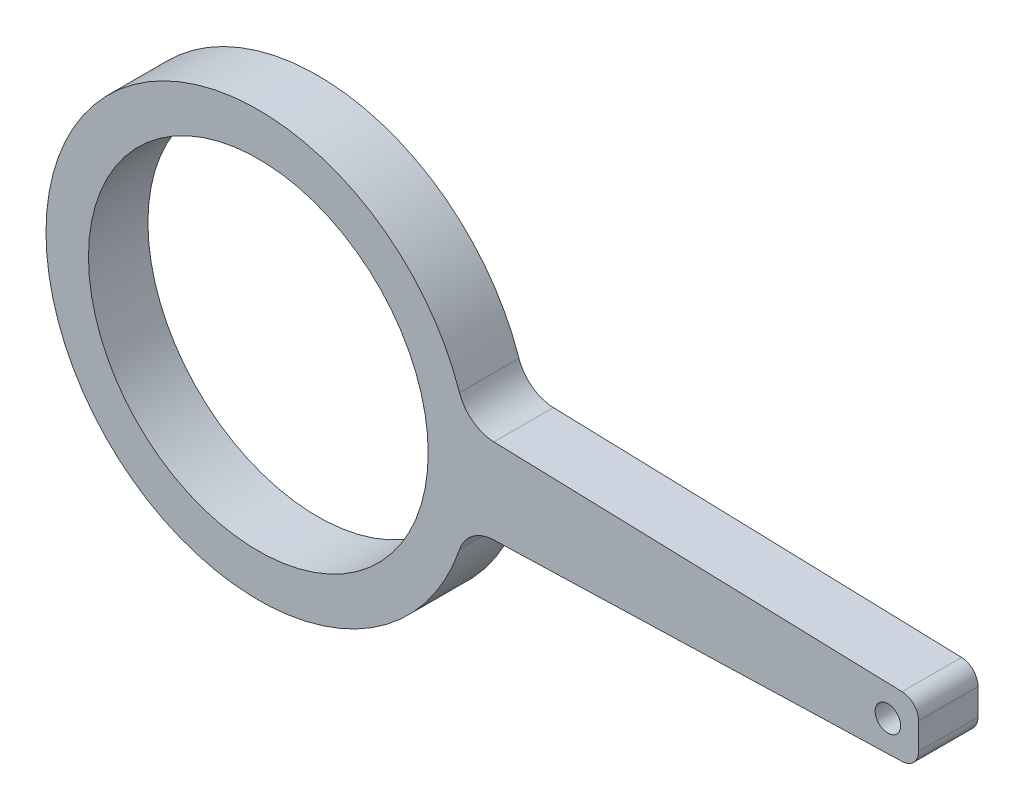
ISO-10303-21;
HEADER;
FILE_DESCRIPTION(('STEP AP214'),'2;1');
FILE_NAME('part.step','',(''),(''),'','','');
FILE_SCHEMA(('AUTOMOTIVE_DESIGN { 1 0 10303 214 1 1 1 1 }'));
ENDSEC;
DATA;
#1=APPLICATION_CONTEXT('core data for automotive mechanical design processes');
#2=APPLICATION_PROTOCOL_DEFINITION('international standard','automotive_design',2000,#1);
#3=PRODUCT_CONTEXT('',#1,'mechanical');
#4=PRODUCT('Part','Part','',(#3));
#5=PRODUCT_RELATED_PRODUCT_CATEGORY('part','',(#4));
#6=PRODUCT_DEFINITION_FORMATION('','',#4);
#7=PRODUCT_DEFINITION_CONTEXT('part definition',#1,'design');
#8=PRODUCT_DEFINITION('design','',#6,#7);
#9=PRODUCT_DEFINITION_SHAPE('','',#8);
#10=(LENGTH_UNIT() NAMED_UNIT(*) SI_UNIT(.MILLI.,.METRE.));
#11=(NAMED_UNIT(*) PLANE_ANGLE_UNIT() SI_UNIT($,.RADIAN.));
#12=(NAMED_UNIT(*) SI_UNIT($,.STERADIAN.) SOLID_ANGLE_UNIT());
#13=UNCERTAINTY_MEASURE_WITH_UNIT(LENGTH_MEASURE(1.E-05),#10,'distance_accuracy_value','');
#14=(GEOMETRIC_REPRESENTATION_CONTEXT(3) GLOBAL_UNCERTAINTY_ASSIGNED_CONTEXT((#13)) GLOBAL_UNIT_ASSIGNED_CONTEXT((#10,
#11,#12)) REPRESENTATION_CONTEXT('',''));
#15=CARTESIAN_POINT('',(0.,0.,0.));
#16=DIRECTION('',(0.,0.,1.));
#17=DIRECTION('',(1.,0.,0.));
#18=AXIS2_PLACEMENT_3D('',#15,#16,#17);
#19=CARTESIAN_POINT('',(27.867987837351,9.41269894962,7.));
#20=DIRECTION('',(0.,0.,-1.));
#21=DIRECTION('',(-1.,0.,0.));
#22=AXIS2_PLACEMENT_3D('',#19,#20,#21);
#23=PLANE('',#22);
#24=CARTESIAN_POINT('',(27.867987837351,9.41269894962,7.));
#25=DIRECTION('',(0.,0.,-1.));
#26=DIRECTION('',(-1.,0.,0.));
#27=AXIS2_PLACEMENT_3D('',#24,#25,#26);
#28=CIRCLE('',#27,4.4146842175625);
#29=CARTESIAN_POINT('',(27.7356068688624,5.,7.));
#30=VERTEX_POINT('',#29);
#31=CARTESIAN_POINT('',(23.685438564654,8.,7.));
#32=VERTEX_POINT('',#31);
#33=EDGE_CURVE('E145',#30,#32,#28,.T.);
#34=ORIENTED_EDGE('',*,*,#33,.T.);
#35=CARTESIAN_POINT('',(0.,0.,7.));
#36=DIRECTION('',(0.,0.,1.));
#37=DIRECTION('',(1.,0.,0.));
#38=AXIS2_PLACEMENT_3D('',#35,#36,#37);
#39=CIRCLE('',#38,25.);
#40=CARTESIAN_POINT('',(23.685438564654,-8.,7.));
#41=VERTEX_POINT('',#40);
#42=EDGE_CURVE('E93',#32,#41,#39,.T.);
#43=ORIENTED_EDGE('',*,*,#42,.T.);
#44=CARTESIAN_POINT('',(27.867987837351,-9.41269894962,7.));
#45=DIRECTION('',(0.,0.,-1.));
#46=DIRECTION('',(1.,0.,0.));
#47=AXIS2_PLACEMENT_3D('',#44,#45,#46);
#48=CIRCLE('',#47,4.4146842175625);
#49=CARTESIAN_POINT('',(27.7356068688624,-5.,7.));
#50=VERTEX_POINT('',#49);
#51=EDGE_CURVE('E160',#41,#50,#48,.T.);
#52=ORIENTED_EDGE('',*,*,#51,.T.);
#53=DIRECTION('',(0.999550303522367,0.029986509105671,0.));
#54=VECTOR('',#53,1.);
#55=CARTESIAN_POINT('',(75.7955798870737,-3.55820080945366,7.));
#56=LINE('',#55,#54);
#57=CARTESIAN_POINT('',(75.7955798870737,-3.55820080945366,7.));
#58=VERTEX_POINT('',#57);
#59=EDGE_CURVE('E173',#50,#58,#56,.T.);
#60=ORIENTED_EDGE('',*,*,#59,.T.);
#61=CARTESIAN_POINT('',(75.7356068688623,-1.55910020240893,7.));
#62=DIRECTION('',(0.,0.,1.));
#63=DIRECTION('',(-1.,0.,0.));
#64=AXIS2_PLACEMENT_3D('',#61,#62,#63);
#65=CIRCLE('',#64,2.);
#66=CARTESIAN_POINT('',(77.7356068688623,-1.55910020240891,7.));
#67=VERTEX_POINT('',#66);
#68=EDGE_CURVE('E112',#58,#67,#65,.T.);
#69=ORIENTED_EDGE('',*,*,#68,.T.);
#70=DIRECTION('',(0.,1.,0.));
#71=VECTOR('',#70,1.);
#72=CARTESIAN_POINT('',(77.7356068688623,-1.55910020240891,7.));
#73=LINE('',#72,#71);
#74=CARTESIAN_POINT('',(77.7356068688624,1.55910020240891,7.));
#75=VERTEX_POINT('',#74);
#76=EDGE_CURVE('E106',#67,#75,#73,.T.);
#77=ORIENTED_EDGE('',*,*,#76,.T.);
#78=CARTESIAN_POINT('',(75.7356068688624,1.55910020240893,7.));
#79=DIRECTION('',(0.,0.,1.));
#80=DIRECTION('',(1.,0.,0.));
#81=AXIS2_PLACEMENT_3D('',#78,#79,#80);
#82=CIRCLE('',#81,2.);
#83=CARTESIAN_POINT('',(75.7955798870737,3.55820080945366,7.));
#84=VERTEX_POINT('',#83);
#85=EDGE_CURVE('E110',#75,#84,#82,.T.);
#86=ORIENTED_EDGE('',*,*,#85,.T.);
#87=DIRECTION('',(-0.999550303522367,0.029986509105671,0.));
#88=VECTOR('',#87,1.);
#89=CARTESIAN_POINT('',(75.7955798870737,3.55820080945366,7.));
#90=LINE('',#89,#88);
#91=EDGE_CURVE('E50',#84,#30,#90,.T.);
#92=ORIENTED_EDGE('',*,*,#91,.T.);
#93=EDGE_LOOP('',(#34,#43,#52,#60,#69,#77,#86,#92));
#94=FACE_BOUND('',#93,.T.);
#95=CARTESIAN_POINT('',(0.,0.,7.));
#96=DIRECTION('',(0.,0.,1.));
#97=DIRECTION('',(1.,0.,0.));
#98=AXIS2_PLACEMENT_3D('',#95,#96,#97);
#99=CIRCLE('',#98,20.);
#100=CARTESIAN_POINT('',(20.,0.,7.));
#101=VERTEX_POINT('',#100);
#102=EDGE_CURVE('E134',#101,#101,#99,.T.);
#103=ORIENTED_EDGE('',*,*,#102,.F.);
#104=EDGE_LOOP('',(#103));
#105=FACE_BOUND('',#104,.T.);
#106=CARTESIAN_POINT('',(74.127359446182,0.,7.));
#107=DIRECTION('',(0.,0.,1.));
#108=DIRECTION('',(1.,0.,0.));
#109=AXIS2_PLACEMENT_3D('',#106,#107,#108);
#110=CIRCLE('',#109,1.5);
#111=CARTESIAN_POINT('',(75.627359446182,0.,7.));
#112=VERTEX_POINT('',#111);
#113=EDGE_CURVE('E182',#112,#112,#110,.T.);
#114=ORIENTED_EDGE('',*,*,#113,.F.);
#115=EDGE_LOOP('',(#114));
#116=FACE_BOUND('',#115,.T.);
#117=ADVANCED_FACE('F33',(#94,#105,#116),#23,.F.);
#118=CARTESIAN_POINT('',(27.867987837351,9.41269894962,0.));
#119=DIRECTION('',(0.,0.,-1.));
#120=DIRECTION('',(-1.,0.,0.));
#121=AXIS2_PLACEMENT_3D('',#118,#119,#120);
#122=PLANE('',#121);
#123=CARTESIAN_POINT('',(0.,0.,0.));
#124=DIRECTION('',(0.,0.,1.));
#125=DIRECTION('',(1.,0.,0.));
#126=AXIS2_PLACEMENT_3D('',#123,#124,#125);
#127=CIRCLE('',#126,20.);
#128=CARTESIAN_POINT('',(20.,0.,0.));
#129=VERTEX_POINT('',#128);
#130=EDGE_CURVE('E179',#129,#129,#127,.T.);
#131=ORIENTED_EDGE('',*,*,#130,.T.);
#132=EDGE_LOOP('',(#131));
#133=FACE_BOUND('',#132,.T.);
#134=CARTESIAN_POINT('',(27.867987837351,9.41269894962,0.));
#135=DIRECTION('',(0.,0.,-1.));
#136=DIRECTION('',(-1.,0.,0.));
#137=AXIS2_PLACEMENT_3D('',#134,#135,#136);
#138=CIRCLE('',#137,4.4146842175625);
#139=CARTESIAN_POINT('',(27.7356068688624,5.,0.));
#140=VERTEX_POINT('',#139);
#141=CARTESIAN_POINT('',(23.685438564654,8.,0.));
#142=VERTEX_POINT('',#141);
#143=EDGE_CURVE('E130',#140,#142,#138,.T.);
#144=ORIENTED_EDGE('',*,*,#143,.F.);
#145=DIRECTION('',(-0.999550303522367,0.029986509105671,0.));
#146=VECTOR('',#145,1.);
#147=CARTESIAN_POINT('',(75.7955798870737,3.55820080945366,0.));
#148=LINE('',#147,#146);
#149=CARTESIAN_POINT('',(75.7955798870737,3.55820080945366,0.));
#150=VERTEX_POINT('',#149);
#151=EDGE_CURVE('E85',#150,#140,#148,.T.);
#152=ORIENTED_EDGE('',*,*,#151,.F.);
#153=CARTESIAN_POINT('',(75.7356068688624,1.55910020240893,0.));
#154=DIRECTION('',(0.,0.,1.));
#155=DIRECTION('',(1.,0.,0.));
#156=AXIS2_PLACEMENT_3D('',#153,#154,#155);
#157=CIRCLE('',#156,2.);
#158=CARTESIAN_POINT('',(77.7356068688624,1.55910020240891,0.));
#159=VERTEX_POINT('',#158);
#160=EDGE_CURVE('E79',#159,#150,#157,.T.);
#161=ORIENTED_EDGE('',*,*,#160,.F.);
#162=DIRECTION('',(0.,1.,0.));
#163=VECTOR('',#162,1.);
#164=CARTESIAN_POINT('',(77.7356068688623,-1.55910020240891,0.));
#165=LINE('',#164,#163);
#166=CARTESIAN_POINT('',(77.7356068688623,-1.55910020240891,0.));
#167=VERTEX_POINT('',#166);
#168=EDGE_CURVE('E120',#167,#159,#165,.T.);
#169=ORIENTED_EDGE('',*,*,#168,.F.);
#170=CARTESIAN_POINT('',(75.7356068688623,-1.55910020240893,0.));
#171=DIRECTION('',(0.,0.,1.));
#172=DIRECTION('',(-1.,0.,0.));
#173=AXIS2_PLACEMENT_3D('',#170,#171,#172);
#174=CIRCLE('',#173,2.);
#175=CARTESIAN_POINT('',(75.7955798870737,-3.55820080945366,0.));
#176=VERTEX_POINT('',#175);
#177=EDGE_CURVE('E140',#176,#167,#174,.T.);
#178=ORIENTED_EDGE('',*,*,#177,.F.);
#179=DIRECTION('',(0.999550303522367,0.029986509105671,0.));
#180=VECTOR('',#179,1.);
#181=CARTESIAN_POINT('',(75.7955798870737,-3.55820080945366,0.));
#182=LINE('',#181,#180);
#183=CARTESIAN_POINT('',(27.7356068688624,-5.,0.));
#184=VERTEX_POINT('',#183);
#185=EDGE_CURVE('E138',#184,#176,#182,.T.);
#186=ORIENTED_EDGE('',*,*,#185,.F.);
#187=CARTESIAN_POINT('',(27.867987837351,-9.41269894962,0.));
#188=DIRECTION('',(0.,0.,-1.));
#189=DIRECTION('',(1.,0.,0.));
#190=AXIS2_PLACEMENT_3D('',#187,#188,#189);
#191=CIRCLE('',#190,4.4146842175625);
#192=CARTESIAN_POINT('',(23.685438564654,-8.,0.));
#193=VERTEX_POINT('',#192);
#194=EDGE_CURVE('E136',#193,#184,#191,.T.);
#195=ORIENTED_EDGE('',*,*,#194,.F.);
#196=CARTESIAN_POINT('',(0.,0.,0.));
#197=DIRECTION('',(0.,0.,1.));
#198=DIRECTION('',(1.,0.,0.));
#199=AXIS2_PLACEMENT_3D('',#196,#197,#198);
#200=CIRCLE('',#199,25.);
#201=EDGE_CURVE('E133',#142,#193,#200,.T.);
#202=ORIENTED_EDGE('',*,*,#201,.F.);
#203=EDGE_LOOP('',(#144,#152,#161,#169,#178,#186,#195,#202));
#204=FACE_BOUND('',#203,.T.);
#205=CARTESIAN_POINT('',(74.127359446182,0.,0.));
#206=DIRECTION('',(0.,0.,1.));
#207=DIRECTION('',(1.,0.,0.));
#208=AXIS2_PLACEMENT_3D('',#205,#206,#207);
#209=CIRCLE('',#208,1.5);
#210=CARTESIAN_POINT('',(75.627359446182,0.,0.));
#211=VERTEX_POINT('',#210);
#212=EDGE_CURVE('E185',#211,#211,#209,.T.);
#213=ORIENTED_EDGE('',*,*,#212,.T.);
#214=EDGE_LOOP('',(#213));
#215=FACE_BOUND('',#214,.T.);
#216=ADVANCED_FACE('F164',(#133,#204,#215),#122,.T.);
#217=CARTESIAN_POINT('',(27.867987837351,9.41269894962,7.));
#218=DIRECTION('',(0.,0.,-1.));
#219=DIRECTION('',(-1.,0.,0.));
#220=AXIS2_PLACEMENT_3D('',#217,#218,#219);
#221=CYLINDRICAL_SURFACE('',#220,4.4146842175625);
#222=ORIENTED_EDGE('',*,*,#143,.T.);
#223=DIRECTION('',(0.,0.,-1.));
#224=VECTOR('',#223,1.);
#225=CARTESIAN_POINT('',(23.685438564654,8.,7.));
#226=LINE('',#225,#224);
#227=EDGE_CURVE('E11',#32,#142,#226,.T.);
#228=ORIENTED_EDGE('',*,*,#227,.F.);
#229=ORIENTED_EDGE('',*,*,#33,.F.);
#230=DIRECTION('',(0.,0.,-1.));
#231=VECTOR('',#230,1.);
#232=CARTESIAN_POINT('',(27.7356068688624,5.,7.));
#233=LINE('',#232,#231);
#234=EDGE_CURVE('E126',#30,#140,#233,.T.);
#235=ORIENTED_EDGE('',*,*,#234,.T.);
#236=EDGE_LOOP('',(#222,#228,#229,#235));
#237=FACE_BOUND('',#236,.T.);
#238=ADVANCED_FACE('F35',(#237),#221,.F.);
#239=CARTESIAN_POINT('',(0.,0.,7.));
#240=DIRECTION('',(0.,0.,-1.));
#241=DIRECTION('',(-1.,0.,0.));
#242=AXIS2_PLACEMENT_3D('',#239,#240,#241);
#243=CYLINDRICAL_SURFACE('',#242,25.);
#244=ORIENTED_EDGE('',*,*,#201,.T.);
#245=DIRECTION('',(0.,0.,-1.));
#246=VECTOR('',#245,1.);
#247=CARTESIAN_POINT('',(23.685438564654,-8.,7.));
#248=LINE('',#247,#246);
#249=EDGE_CURVE('E42',#41,#193,#248,.T.);
#250=ORIENTED_EDGE('',*,*,#249,.F.);
#251=ORIENTED_EDGE('',*,*,#42,.F.);
#252=ORIENTED_EDGE('',*,*,#227,.T.);
#253=EDGE_LOOP('',(#244,#250,#251,#252));
#254=FACE_BOUND('',#253,.T.);
#255=ADVANCED_FACE('F217',(#254),#243,.T.);
#256=CARTESIAN_POINT('',(27.867987837351,-9.41269894962,7.));
#257=DIRECTION('',(0.,0.,-1.));
#258=DIRECTION('',(-1.,0.,0.));
#259=AXIS2_PLACEMENT_3D('',#256,#257,#258);
#260=CYLINDRICAL_SURFACE('',#259,4.4146842175625);
#261=ORIENTED_EDGE('',*,*,#194,.T.);
#262=DIRECTION('',(0.,0.,-1.));
#263=VECTOR('',#262,1.);
#264=CARTESIAN_POINT('',(27.7356068688624,-5.,7.));
#265=LINE('',#264,#263);
#266=EDGE_CURVE('E152',#50,#184,#265,.T.);
#267=ORIENTED_EDGE('',*,*,#266,.F.);
#268=ORIENTED_EDGE('',*,*,#51,.F.);
#269=ORIENTED_EDGE('',*,*,#249,.T.);
#270=EDGE_LOOP('',(#261,#267,#268,#269));
#271=FACE_BOUND('',#270,.T.);
#272=ADVANCED_FACE('F158',(#271),#260,.F.);
#273=CARTESIAN_POINT('',(75.7955798870737,-3.55820080945366,7.));
#274=DIRECTION('',(-0.029986509105671,0.999550303522367,0.));
#275=DIRECTION('',(-0.999550303522367,-0.029986509105671,0.));
#276=AXIS2_PLACEMENT_3D('',#273,#274,#275);
#277=PLANE('',#276);
#278=ORIENTED_EDGE('',*,*,#185,.T.);
#279=DIRECTION('',(0.,0.,-1.));
#280=VECTOR('',#279,1.);
#281=CARTESIAN_POINT('',(75.7955798870737,-3.55820080945366,7.));
#282=LINE('',#281,#280);
#283=EDGE_CURVE('E149',#58,#176,#282,.T.);
#284=ORIENTED_EDGE('',*,*,#283,.F.);
#285=ORIENTED_EDGE('',*,*,#59,.F.);
#286=ORIENTED_EDGE('',*,*,#266,.T.);
#287=EDGE_LOOP('',(#278,#284,#285,#286));
#288=FACE_BOUND('',#287,.T.);
#289=ADVANCED_FACE('F169',(#288),#277,.F.);
#290=CARTESIAN_POINT('',(75.7356068688623,-1.55910020240893,7.));
#291=DIRECTION('',(0.,0.,-1.));
#292=DIRECTION('',(-1.,0.,0.));
#293=AXIS2_PLACEMENT_3D('',#290,#291,#292);
#294=CYLINDRICAL_SURFACE('',#293,2.);
#295=ORIENTED_EDGE('',*,*,#177,.T.);
#296=DIRECTION('',(0.,0.,-1.));
#297=VECTOR('',#296,1.);
#298=CARTESIAN_POINT('',(77.7356068688623,-1.55910020240891,7.));
#299=LINE('',#298,#297);
#300=EDGE_CURVE('E121',#67,#167,#299,.T.);
#301=ORIENTED_EDGE('',*,*,#300,.F.);
#302=ORIENTED_EDGE('',*,*,#68,.F.);
#303=ORIENTED_EDGE('',*,*,#283,.T.);
#304=EDGE_LOOP('',(#295,#301,#302,#303));
#305=FACE_BOUND('',#304,.T.);
#306=ADVANCED_FACE('F172',(#305),#294,.T.);
#307=CARTESIAN_POINT('',(77.7356068688623,-1.55910020240891,7.));
#308=DIRECTION('',(-1.,0.,0.));
#309=DIRECTION('',(0.,-1.,0.));
#310=AXIS2_PLACEMENT_3D('',#307,#308,#309);
#311=PLANE('',#310);
#312=ORIENTED_EDGE('',*,*,#168,.T.);
#313=DIRECTION('',(0.,0.,-1.));
#314=VECTOR('',#313,1.);
#315=CARTESIAN_POINT('',(77.7356068688624,1.55910020240891,7.));
#316=LINE('',#315,#314);
#317=EDGE_CURVE('E117',#75,#159,#316,.T.);
#318=ORIENTED_EDGE('',*,*,#317,.F.);
#319=ORIENTED_EDGE('',*,*,#76,.F.);
#320=ORIENTED_EDGE('',*,*,#300,.T.);
#321=EDGE_LOOP('',(#312,#318,#319,#320));
#322=FACE_BOUND('',#321,.T.);
#323=ADVANCED_FACE('F118',(#322),#311,.F.);
#324=CARTESIAN_POINT('',(75.7356068688624,1.55910020240893,7.));
#325=DIRECTION('',(0.,0.,-1.));
#326=DIRECTION('',(-1.,0.,0.));
#327=AXIS2_PLACEMENT_3D('',#324,#325,#326);
#328=CYLINDRICAL_SURFACE('',#327,2.);
#329=ORIENTED_EDGE('',*,*,#160,.T.);
#330=DIRECTION('',(0.,0.,-1.));
#331=VECTOR('',#330,1.);
#332=CARTESIAN_POINT('',(75.7955798870737,3.55820080945366,7.));
#333=LINE('',#332,#331);
#334=EDGE_CURVE('E122',#84,#150,#333,.T.);
#335=ORIENTED_EDGE('',*,*,#334,.F.);
#336=ORIENTED_EDGE('',*,*,#85,.F.);
#337=ORIENTED_EDGE('',*,*,#317,.T.);
#338=EDGE_LOOP('',(#329,#335,#336,#337));
#339=FACE_BOUND('',#338,.T.);
#340=ADVANCED_FACE('F124',(#339),#328,.T.);
#341=CARTESIAN_POINT('',(75.7955798870737,3.55820080945366,7.));
#342=DIRECTION('',(-0.029986509105671,-0.999550303522367,0.));
#343=DIRECTION('',(0.999550303522367,-0.029986509105671,0.));
#344=AXIS2_PLACEMENT_3D('',#341,#342,#343);
#345=PLANE('',#344);
#346=ORIENTED_EDGE('',*,*,#151,.T.);
#347=ORIENTED_EDGE('',*,*,#234,.F.);
#348=ORIENTED_EDGE('',*,*,#91,.F.);
#349=ORIENTED_EDGE('',*,*,#334,.T.);
#350=EDGE_LOOP('',(#346,#347,#348,#349));
#351=FACE_BOUND('',#350,.T.);
#352=ADVANCED_FACE('F205',(#351),#345,.F.);
#353=CARTESIAN_POINT('',(0.,0.,7.));
#354=DIRECTION('',(0.,0.,-1.));
#355=DIRECTION('',(-1.,0.,0.));
#356=AXIS2_PLACEMENT_3D('',#353,#354,#355);
#357=CYLINDRICAL_SURFACE('',#356,20.);
#358=ORIENTED_EDGE('',*,*,#102,.T.);
#359=EDGE_LOOP('',(#358));
#360=FACE_BOUND('',#359,.T.);
#361=ORIENTED_EDGE('',*,*,#130,.F.);
#362=EDGE_LOOP('',(#361));
#363=FACE_BOUND('',#362,.T.);
#364=ADVANCED_FACE('F202',(#360,#363),#357,.F.);
#365=CARTESIAN_POINT('',(74.127359446182,0.,7.));
#366=DIRECTION('',(0.,0.,-1.));
#367=DIRECTION('',(-1.,0.,0.));
#368=AXIS2_PLACEMENT_3D('',#365,#366,#367);
#369=CYLINDRICAL_SURFACE('',#368,1.5);
#370=ORIENTED_EDGE('',*,*,#113,.T.);
#371=EDGE_LOOP('',(#370));
#372=FACE_BOUND('',#371,.T.);
#373=ORIENTED_EDGE('',*,*,#212,.F.);
#374=EDGE_LOOP('',(#373));
#375=FACE_BOUND('',#374,.T.);
#376=ADVANCED_FACE('F191',(#372,#375),#369,.F.);
#377=CLOSED_SHELL('',(#117,#216,#238,#255,#272,#289,#306,#323,#340,#352,#364,#376));
#378=MANIFOLD_SOLID_BREP('B2',#377);
#379=ADVANCED_BREP_SHAPE_REPRESENTATION('',(#18,#378),#14);
#380=SHAPE_DEFINITION_REPRESENTATION(#9,#379);
ENDSEC;
END-ISO-10303-21;
